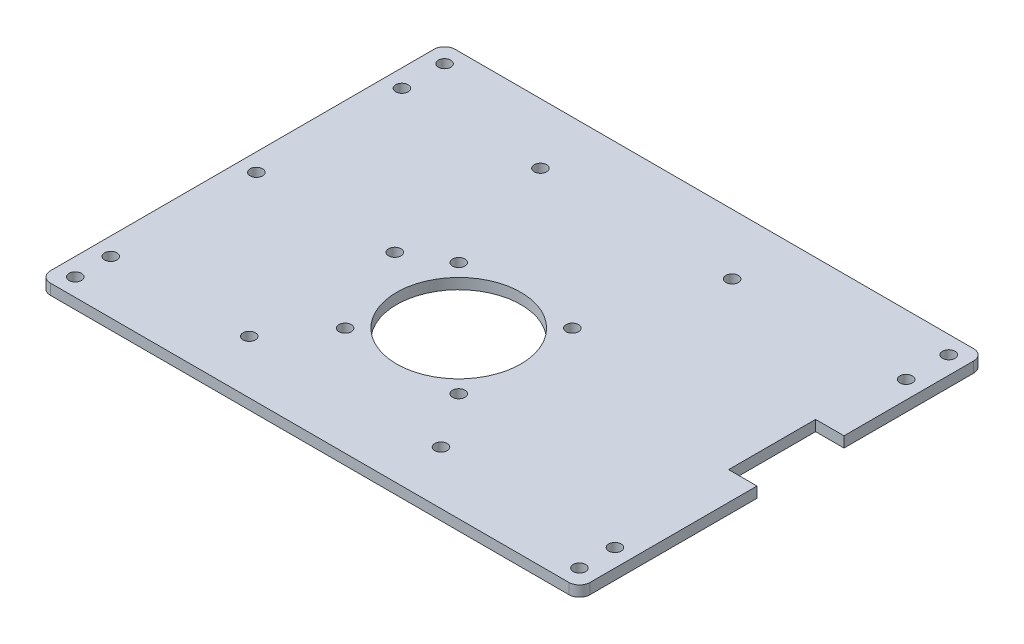
ISO-10303-21;
HEADER;
FILE_DESCRIPTION(('STEP AP214'),'2;1');
FILE_NAME('part.step','',(''),(''),'','','');
FILE_SCHEMA(('AUTOMOTIVE_DESIGN { 1 0 10303 214 1 1 1 1 }'));
ENDSEC;
DATA;
#1=APPLICATION_CONTEXT('core data for automotive mechanical design processes');
#2=APPLICATION_PROTOCOL_DEFINITION('international standard','automotive_design',2000,#1);
#3=PRODUCT_CONTEXT('',#1,'mechanical');
#4=PRODUCT('Part','Part','',(#3));
#5=PRODUCT_RELATED_PRODUCT_CATEGORY('part','',(#4));
#6=PRODUCT_DEFINITION_FORMATION('','',#4);
#7=PRODUCT_DEFINITION_CONTEXT('part definition',#1,'design');
#8=PRODUCT_DEFINITION('design','',#6,#7);
#9=PRODUCT_DEFINITION_SHAPE('','',#8);
#10=(LENGTH_UNIT() NAMED_UNIT(*) SI_UNIT(.MILLI.,.METRE.));
#11=(NAMED_UNIT(*) PLANE_ANGLE_UNIT() SI_UNIT($,.RADIAN.));
#12=(NAMED_UNIT(*) SI_UNIT($,.STERADIAN.) SOLID_ANGLE_UNIT());
#13=UNCERTAINTY_MEASURE_WITH_UNIT(LENGTH_MEASURE(1.E-05),#10,'distance_accuracy_value','');
#14=(GEOMETRIC_REPRESENTATION_CONTEXT(3) GLOBAL_UNCERTAINTY_ASSIGNED_CONTEXT((#13)) GLOBAL_UNIT_ASSIGNED_CONTEXT((#10,
#11,#12)) REPRESENTATION_CONTEXT('',''));
#15=CARTESIAN_POINT('',(0.,0.,0.));
#16=DIRECTION('',(0.,0.,1.));
#17=DIRECTION('',(1.,0.,0.));
#18=AXIS2_PLACEMENT_3D('',#15,#16,#17);
#19=CARTESIAN_POINT('',(-73.,3.,-54.));
#20=DIRECTION('',(0.,-1.,0.));
#21=DIRECTION('',(0.,0.,-1.));
#22=AXIS2_PLACEMENT_3D('',#19,#20,#21);
#23=PLANE('',#22);
#24=CARTESIAN_POINT('',(-73.,3.,-54.));
#25=DIRECTION('',(0.,1.,0.));
#26=DIRECTION('',(0.,0.,-1.));
#27=AXIS2_PLACEMENT_3D('',#24,#25,#26);
#28=CIRCLE('',#27,3.);
#29=CARTESIAN_POINT('',(-73.,3.,-57.));
#30=VERTEX_POINT('',#29);
#31=CARTESIAN_POINT('',(-76.,3.,-54.));
#32=VERTEX_POINT('',#31);
#33=EDGE_CURVE('E181',#30,#32,#28,.T.);
#34=ORIENTED_EDGE('',*,*,#33,.T.);
#35=DIRECTION('',(0.,0.,1.));
#36=VECTOR('',#35,1.);
#37=CARTESIAN_POINT('',(-76.,3.,-54.));
#38=LINE('',#37,#36);
#39=CARTESIAN_POINT('',(-76.,3.,54.));
#40=VERTEX_POINT('',#39);
#41=EDGE_CURVE('E109',#32,#40,#38,.T.);
#42=ORIENTED_EDGE('',*,*,#41,.T.);
#43=CARTESIAN_POINT('',(-73.,3.,54.));
#44=DIRECTION('',(0.,1.,0.));
#45=DIRECTION('',(0.,0.,-1.));
#46=AXIS2_PLACEMENT_3D('',#43,#44,#45);
#47=CIRCLE('',#46,3.);
#48=CARTESIAN_POINT('',(-73.,3.,57.));
#49=VERTEX_POINT('',#48);
#50=EDGE_CURVE('E208',#40,#49,#47,.T.);
#51=ORIENTED_EDGE('',*,*,#50,.T.);
#52=DIRECTION('',(1.,0.,0.));
#53=VECTOR('',#52,1.);
#54=CARTESIAN_POINT('',(-73.,3.,57.));
#55=LINE('',#54,#53);
#56=CARTESIAN_POINT('',(73.,3.,57.));
#57=VERTEX_POINT('',#56);
#58=EDGE_CURVE('E227',#49,#57,#55,.T.);
#59=ORIENTED_EDGE('',*,*,#58,.T.);
#60=CARTESIAN_POINT('',(73.,3.,54.));
#61=DIRECTION('',(0.,1.,0.));
#62=DIRECTION('',(0.,0.,-1.));
#63=AXIS2_PLACEMENT_3D('',#60,#61,#62);
#64=CIRCLE('',#63,3.);
#65=CARTESIAN_POINT('',(76.,3.,54.));
#66=VERTEX_POINT('',#65);
#67=EDGE_CURVE('E224',#57,#66,#64,.T.);
#68=ORIENTED_EDGE('',*,*,#67,.T.);
#69=DIRECTION('',(0.,0.,-1.));
#70=VECTOR('',#69,1.);
#71=CARTESIAN_POINT('',(76.,3.,7.));
#72=LINE('',#71,#70);
#73=CARTESIAN_POINT('',(76.,3.,7.));
#74=VERTEX_POINT('',#73);
#75=EDGE_CURVE('E226',#66,#74,#72,.T.);
#76=ORIENTED_EDGE('',*,*,#75,.T.);
#77=DIRECTION('',(-1.,0.,0.));
#78=VECTOR('',#77,1.);
#79=CARTESIAN_POINT('',(68.,3.,7.));
#80=LINE('',#79,#78);
#81=CARTESIAN_POINT('',(68.,3.,7.));
#82=VERTEX_POINT('',#81);
#83=EDGE_CURVE('E229',#74,#82,#80,.T.);
#84=ORIENTED_EDGE('',*,*,#83,.T.);
#85=DIRECTION('',(0.,0.,-1.));
#86=VECTOR('',#85,1.);
#87=CARTESIAN_POINT('',(68.,3.,-17.5));
#88=LINE('',#87,#86);
#89=CARTESIAN_POINT('',(68.,3.,-17.5));
#90=VERTEX_POINT('',#89);
#91=EDGE_CURVE('E235',#82,#90,#88,.T.);
#92=ORIENTED_EDGE('',*,*,#91,.T.);
#93=DIRECTION('',(1.,0.,0.));
#94=VECTOR('',#93,1.);
#95=CARTESIAN_POINT('',(76.,3.,-17.5));
#96=LINE('',#95,#94);
#97=CARTESIAN_POINT('',(76.,3.,-17.5));
#98=VERTEX_POINT('',#97);
#99=EDGE_CURVE('E140',#90,#98,#96,.T.);
#100=ORIENTED_EDGE('',*,*,#99,.T.);
#101=DIRECTION('',(0.,0.,-1.));
#102=VECTOR('',#101,1.);
#103=CARTESIAN_POINT('',(76.,3.,-54.));
#104=LINE('',#103,#102);
#105=CARTESIAN_POINT('',(76.,3.,-54.));
#106=VERTEX_POINT('',#105);
#107=EDGE_CURVE('E134',#98,#106,#104,.T.);
#108=ORIENTED_EDGE('',*,*,#107,.T.);
#109=CARTESIAN_POINT('',(73.,3.,-54.));
#110=DIRECTION('',(0.,1.,0.));
#111=DIRECTION('',(0.,0.,1.));
#112=AXIS2_PLACEMENT_3D('',#109,#110,#111);
#113=CIRCLE('',#112,3.);
#114=CARTESIAN_POINT('',(73.,3.,-57.));
#115=VERTEX_POINT('',#114);
#116=EDGE_CURVE('E138',#106,#115,#113,.T.);
#117=ORIENTED_EDGE('',*,*,#116,.T.);
#118=DIRECTION('',(-1.,0.,0.));
#119=VECTOR('',#118,1.);
#120=CARTESIAN_POINT('',(-73.,3.,-57.));
#121=LINE('',#120,#119);
#122=EDGE_CURVE('E54',#115,#30,#121,.T.);
#123=ORIENTED_EDGE('',*,*,#122,.T.);
#124=EDGE_LOOP('',(#34,#42,#51,#59,#68,#76,#84,#92,#100,#108,#117,#123));
#125=FACE_BOUND('',#124,.T.);
#126=CARTESIAN_POINT('',(-71.,3.,-51.9999999999995));
#127=DIRECTION('',(0.,1.,0.));
#128=DIRECTION('',(0.,0.,1.));
#129=AXIS2_PLACEMENT_3D('',#126,#127,#128);
#130=CIRCLE('',#129,1.75000000000013);
#131=CARTESIAN_POINT('',(-71.,3.,-50.2499999999994));
#132=VERTEX_POINT('',#131);
#133=EDGE_CURVE('E162',#132,#132,#130,.T.);
#134=ORIENTED_EDGE('',*,*,#133,.F.);
#135=EDGE_LOOP('',(#134));
#136=FACE_BOUND('',#135,.T.);
#137=CARTESIAN_POINT('',(71.,3.,-52.));
#138=DIRECTION('',(0.,1.,0.));
#139=DIRECTION('',(0.,0.,1.));
#140=AXIS2_PLACEMENT_3D('',#137,#138,#139);
#141=CIRCLE('',#140,1.75);
#142=CARTESIAN_POINT('',(71.,3.,-50.25));
#143=VERTEX_POINT('',#142);
#144=EDGE_CURVE('E449',#143,#143,#141,.T.);
#145=ORIENTED_EDGE('',*,*,#144,.F.);
#146=EDGE_LOOP('',(#145));
#147=FACE_BOUND('',#146,.T.);
#148=CARTESIAN_POINT('',(71.0000000000011,3.,52.));
#149=DIRECTION('',(0.,1.,0.));
#150=DIRECTION('',(0.,0.,1.));
#151=AXIS2_PLACEMENT_3D('',#148,#149,#150);
#152=CIRCLE('',#151,1.75);
#153=CARTESIAN_POINT('',(71.0000000000011,3.,53.75));
#154=VERTEX_POINT('',#153);
#155=EDGE_CURVE('E443',#154,#154,#152,.T.);
#156=ORIENTED_EDGE('',*,*,#155,.F.);
#157=EDGE_LOOP('',(#156));
#158=FACE_BOUND('',#157,.T.);
#159=CARTESIAN_POINT('',(-70.9999999999989,3.,52.));
#160=DIRECTION('',(0.,1.,0.));
#161=DIRECTION('',(0.,0.,1.));
#162=AXIS2_PLACEMENT_3D('',#159,#160,#161);
#163=CIRCLE('',#162,1.75);
#164=CARTESIAN_POINT('',(-70.9999999999989,3.,53.75));
#165=VERTEX_POINT('',#164);
#166=EDGE_CURVE('E437',#165,#165,#163,.T.);
#167=ORIENTED_EDGE('',*,*,#166,.F.);
#168=EDGE_LOOP('',(#167));
#169=FACE_BOUND('',#168,.T.);
#170=CARTESIAN_POINT('',(70.9999999999966,3.,-40.0000000000005));
#171=DIRECTION('',(0.,1.,0.));
#172=DIRECTION('',(0.,0.,1.));
#173=AXIS2_PLACEMENT_3D('',#170,#171,#172);
#174=CIRCLE('',#173,1.75000000000303);
#175=CARTESIAN_POINT('',(70.9999999999966,3.,-38.2499999999975));
#176=VERTEX_POINT('',#175);
#177=EDGE_CURVE('E431',#176,#176,#174,.T.);
#178=ORIENTED_EDGE('',*,*,#177,.F.);
#179=EDGE_LOOP('',(#178));
#180=FACE_BOUND('',#179,.T.);
#181=CARTESIAN_POINT('',(-4.50000000000001,3.,10.5));
#182=DIRECTION('',(0.,1.,0.));
#183=DIRECTION('',(0.,0.,1.));
#184=AXIS2_PLACEMENT_3D('',#181,#182,#183);
#185=CIRCLE('',#184,17.5);
#186=CARTESIAN_POINT('',(-4.50000000000001,3.,28.));
#187=VERTEX_POINT('',#186);
#188=EDGE_CURVE('E425',#187,#187,#185,.T.);
#189=ORIENTED_EDGE('',*,*,#188,.F.);
#190=EDGE_LOOP('',(#189));
#191=FACE_BOUND('',#190,.T.);
#192=CARTESIAN_POINT('',(-20.5,3.,-5.49999999999988));
#193=DIRECTION('',(0.,1.,0.));
#194=DIRECTION('',(0.,0.,1.));
#195=AXIS2_PLACEMENT_3D('',#192,#193,#194);
#196=CIRCLE('',#195,1.75000000000005);
#197=CARTESIAN_POINT('',(-20.5,3.,-3.74999999999983));
#198=VERTEX_POINT('',#197);
#199=EDGE_CURVE('E419',#198,#198,#196,.T.);
#200=ORIENTED_EDGE('',*,*,#199,.F.);
#201=EDGE_LOOP('',(#200));
#202=FACE_BOUND('',#201,.T.);
#203=CARTESIAN_POINT('',(11.5,3.,-5.5));
#204=DIRECTION('',(0.,1.,0.));
#205=DIRECTION('',(0.,0.,1.));
#206=AXIS2_PLACEMENT_3D('',#203,#204,#205);
#207=CIRCLE('',#206,1.75);
#208=CARTESIAN_POINT('',(11.5,3.,-3.75));
#209=VERTEX_POINT('',#208);
#210=EDGE_CURVE('E413',#209,#209,#207,.T.);
#211=ORIENTED_EDGE('',*,*,#210,.F.);
#212=EDGE_LOOP('',(#211));
#213=FACE_BOUND('',#212,.T.);
#214=CARTESIAN_POINT('',(11.5000000000003,3.,26.5));
#215=DIRECTION('',(0.,1.,0.));
#216=DIRECTION('',(0.,0.,1.));
#217=AXIS2_PLACEMENT_3D('',#214,#215,#216);
#218=CIRCLE('',#217,1.75);
#219=CARTESIAN_POINT('',(11.5000000000003,3.,28.25));
#220=VERTEX_POINT('',#219);
#221=EDGE_CURVE('E407',#220,#220,#218,.T.);
#222=ORIENTED_EDGE('',*,*,#221,.F.);
#223=EDGE_LOOP('',(#222));
#224=FACE_BOUND('',#223,.T.);
#225=CARTESIAN_POINT('',(-20.4999999999997,3.,26.5));
#226=DIRECTION('',(0.,1.,0.));
#227=DIRECTION('',(0.,0.,1.));
#228=AXIS2_PLACEMENT_3D('',#225,#226,#227);
#229=CIRCLE('',#228,1.75);
#230=CARTESIAN_POINT('',(-20.4999999999997,3.,28.25));
#231=VERTEX_POINT('',#230);
#232=EDGE_CURVE('E401',#231,#231,#229,.T.);
#233=ORIENTED_EDGE('',*,*,#232,.F.);
#234=EDGE_LOOP('',(#233));
#235=FACE_BOUND('',#234,.T.);
#236=CARTESIAN_POINT('',(22.,3.,-39.9999999999997));
#237=DIRECTION('',(0.,1.,0.));
#238=DIRECTION('',(0.,0.,1.));
#239=AXIS2_PLACEMENT_3D('',#236,#237,#238);
#240=CIRCLE('',#239,1.75);
#241=CARTESIAN_POINT('',(22.,3.,-38.2499999999997));
#242=VERTEX_POINT('',#241);
#243=EDGE_CURVE('E395',#242,#242,#240,.T.);
#244=ORIENTED_EDGE('',*,*,#243,.F.);
#245=EDGE_LOOP('',(#244));
#246=FACE_BOUND('',#245,.T.);
#247=CARTESIAN_POINT('',(22.0000000000008,3.,42.0000000000003));
#248=DIRECTION('',(0.,1.,0.));
#249=DIRECTION('',(0.,0.,1.));
#250=AXIS2_PLACEMENT_3D('',#247,#248,#249);
#251=CIRCLE('',#250,1.75);
#252=CARTESIAN_POINT('',(22.0000000000008,3.,43.7500000000003));
#253=VERTEX_POINT('',#252);
#254=EDGE_CURVE('E389',#253,#253,#251,.T.);
#255=ORIENTED_EDGE('',*,*,#254,.F.);
#256=EDGE_LOOP('',(#255));
#257=FACE_BOUND('',#256,.T.);
#258=CARTESIAN_POINT('',(70.9999999999989,3.,42.));
#259=DIRECTION('',(0.,1.,0.));
#260=DIRECTION('',(0.,0.,1.));
#261=AXIS2_PLACEMENT_3D('',#258,#259,#260);
#262=CIRCLE('',#261,1.75000000000185);
#263=CARTESIAN_POINT('',(70.9999999999989,3.,43.7500000000018));
#264=VERTEX_POINT('',#263);
#265=EDGE_CURVE('E383',#264,#264,#262,.T.);
#266=ORIENTED_EDGE('',*,*,#265,.F.);
#267=EDGE_LOOP('',(#266));
#268=FACE_BOUND('',#267,.T.);
#269=CARTESIAN_POINT('',(-70.9999999999975,3.,-40.0000000000005));
#270=DIRECTION('',(0.,1.,0.));
#271=DIRECTION('',(0.,0.,-1.));
#272=AXIS2_PLACEMENT_3D('',#269,#270,#271);
#273=CIRCLE('',#272,1.75000000000224);
#274=CARTESIAN_POINT('',(-70.9999999999975,3.,-41.7500000000027));
#275=VERTEX_POINT('',#274);
#276=EDGE_CURVE('E377',#275,#275,#273,.T.);
#277=ORIENTED_EDGE('',*,*,#276,.F.);
#278=EDGE_LOOP('',(#277));
#279=FACE_BOUND('',#278,.T.);
#280=CARTESIAN_POINT('',(-31.9999999999975,3.,-40.0000000000005));
#281=DIRECTION('',(0.,1.,0.));
#282=DIRECTION('',(0.,0.,-1.));
#283=AXIS2_PLACEMENT_3D('',#280,#281,#282);
#284=CIRCLE('',#283,1.75000000000224);
#285=CARTESIAN_POINT('',(-31.9999999999975,3.,-41.7500000000027));
#286=VERTEX_POINT('',#285);
#287=EDGE_CURVE('E371',#286,#286,#284,.T.);
#288=ORIENTED_EDGE('',*,*,#287,.F.);
#289=EDGE_LOOP('',(#288));
#290=FACE_BOUND('',#289,.T.);
#291=CARTESIAN_POINT('',(-31.9999999999971,3.,0.999999999999494));
#292=DIRECTION('',(0.,1.,0.));
#293=DIRECTION('',(0.,0.,-1.));
#294=AXIS2_PLACEMENT_3D('',#291,#292,#293);
#295=CIRCLE('',#294,1.75000000000224);
#296=CARTESIAN_POINT('',(-31.9999999999971,3.,-0.750000000002742));
#297=VERTEX_POINT('',#296);
#298=EDGE_CURVE('E365',#297,#297,#295,.T.);
#299=ORIENTED_EDGE('',*,*,#298,.F.);
#300=EDGE_LOOP('',(#299));
#301=FACE_BOUND('',#300,.T.);
#302=CARTESIAN_POINT('',(-31.9999999999966,3.,41.9999999999995));
#303=DIRECTION('',(0.,1.,0.));
#304=DIRECTION('',(0.,0.,-1.));
#305=AXIS2_PLACEMENT_3D('',#302,#303,#304);
#306=CIRCLE('',#305,1.75000000000224);
#307=CARTESIAN_POINT('',(-31.9999999999966,3.,40.2499999999973));
#308=VERTEX_POINT('',#307);
#309=EDGE_CURVE('E359',#308,#308,#306,.T.);
#310=ORIENTED_EDGE('',*,*,#309,.F.);
#311=EDGE_LOOP('',(#310));
#312=FACE_BOUND('',#311,.T.);
#313=CARTESIAN_POINT('',(-70.9999999999971,3.,0.999999999999494));
#314=DIRECTION('',(0.,1.,0.));
#315=DIRECTION('',(0.,0.,-1.));
#316=AXIS2_PLACEMENT_3D('',#313,#314,#315);
#317=CIRCLE('',#316,1.75000000000224);
#318=CARTESIAN_POINT('',(-70.9999999999971,3.,-0.750000000002742));
#319=VERTEX_POINT('',#318);
#320=EDGE_CURVE('E353',#319,#319,#317,.T.);
#321=ORIENTED_EDGE('',*,*,#320,.F.);
#322=EDGE_LOOP('',(#321));
#323=FACE_BOUND('',#322,.T.);
#324=CARTESIAN_POINT('',(-70.9999999999966,3.,41.9999999999995));
#325=DIRECTION('',(0.,1.,0.));
#326=DIRECTION('',(0.,0.,-1.));
#327=AXIS2_PLACEMENT_3D('',#324,#325,#326);
#328=CIRCLE('',#327,1.75000000000224);
#329=CARTESIAN_POINT('',(-70.9999999999966,3.,40.2499999999973));
#330=VERTEX_POINT('',#329);
#331=EDGE_CURVE('E344',#330,#330,#328,.T.);
#332=ORIENTED_EDGE('',*,*,#331,.F.);
#333=EDGE_LOOP('',(#332));
#334=FACE_BOUND('',#333,.T.);
#335=ADVANCED_FACE('F37',(#125,#136,#147,#158,#169,#180,#191,#202,#213,#224,#235,#246,#257,#268,
#279,#290,#301,#312,#323,#334),#23,.F.);
#336=CARTESIAN_POINT('',(-73.,0.,-54.));
#337=DIRECTION('',(0.,-1.,0.));
#338=DIRECTION('',(0.,0.,-1.));
#339=AXIS2_PLACEMENT_3D('',#336,#337,#338);
#340=PLANE('',#339);
#341=CARTESIAN_POINT('',(-70.9999999999971,0.,0.999999999999494));
#342=DIRECTION('',(0.,1.,0.));
#343=DIRECTION('',(0.,0.,-1.));
#344=AXIS2_PLACEMENT_3D('',#341,#342,#343);
#345=CIRCLE('',#344,1.75000000000224);
#346=CARTESIAN_POINT('',(-70.9999999999971,0.,-0.750000000002742));
#347=VERTEX_POINT('',#346);
#348=EDGE_CURVE('E350',#347,#347,#345,.T.);
#349=ORIENTED_EDGE('',*,*,#348,.T.);
#350=EDGE_LOOP('',(#349));
#351=FACE_BOUND('',#350,.T.);
#352=CARTESIAN_POINT('',(-31.9999999999971,0.,0.999999999999494));
#353=DIRECTION('',(0.,1.,0.));
#354=DIRECTION('',(0.,0.,-1.));
#355=AXIS2_PLACEMENT_3D('',#352,#353,#354);
#356=CIRCLE('',#355,1.75000000000224);
#357=CARTESIAN_POINT('',(-31.9999999999971,0.,-0.750000000002742));
#358=VERTEX_POINT('',#357);
#359=EDGE_CURVE('E362',#358,#358,#356,.T.);
#360=ORIENTED_EDGE('',*,*,#359,.T.);
#361=EDGE_LOOP('',(#360));
#362=FACE_BOUND('',#361,.T.);
#363=CARTESIAN_POINT('',(-70.9999999999975,0.,-40.0000000000005));
#364=DIRECTION('',(0.,1.,0.));
#365=DIRECTION('',(0.,0.,-1.));
#366=AXIS2_PLACEMENT_3D('',#363,#364,#365);
#367=CIRCLE('',#366,1.75000000000224);
#368=CARTESIAN_POINT('',(-70.9999999999975,0.,-41.7500000000027));
#369=VERTEX_POINT('',#368);
#370=EDGE_CURVE('E374',#369,#369,#367,.T.);
#371=ORIENTED_EDGE('',*,*,#370,.T.);
#372=EDGE_LOOP('',(#371));
#373=FACE_BOUND('',#372,.T.);
#374=CARTESIAN_POINT('',(22.0000000000008,0.,42.0000000000003));
#375=DIRECTION('',(0.,1.,0.));
#376=DIRECTION('',(0.,0.,1.));
#377=AXIS2_PLACEMENT_3D('',#374,#375,#376);
#378=CIRCLE('',#377,1.75);
#379=CARTESIAN_POINT('',(22.0000000000008,0.,43.7500000000003));
#380=VERTEX_POINT('',#379);
#381=EDGE_CURVE('E386',#380,#380,#378,.T.);
#382=ORIENTED_EDGE('',*,*,#381,.T.);
#383=EDGE_LOOP('',(#382));
#384=FACE_BOUND('',#383,.T.);
#385=CARTESIAN_POINT('',(-20.4999999999997,0.,26.5));
#386=DIRECTION('',(0.,1.,0.));
#387=DIRECTION('',(0.,0.,1.));
#388=AXIS2_PLACEMENT_3D('',#385,#386,#387);
#389=CIRCLE('',#388,1.75);
#390=CARTESIAN_POINT('',(-20.4999999999997,0.,28.25));
#391=VERTEX_POINT('',#390);
#392=EDGE_CURVE('E398',#391,#391,#389,.T.);
#393=ORIENTED_EDGE('',*,*,#392,.T.);
#394=EDGE_LOOP('',(#393));
#395=FACE_BOUND('',#394,.T.);
#396=CARTESIAN_POINT('',(11.5,0.,-5.5));
#397=DIRECTION('',(0.,1.,0.));
#398=DIRECTION('',(0.,0.,1.));
#399=AXIS2_PLACEMENT_3D('',#396,#397,#398);
#400=CIRCLE('',#399,1.75);
#401=CARTESIAN_POINT('',(11.5,0.,-3.75));
#402=VERTEX_POINT('',#401);
#403=EDGE_CURVE('E410',#402,#402,#400,.T.);
#404=ORIENTED_EDGE('',*,*,#403,.T.);
#405=EDGE_LOOP('',(#404));
#406=FACE_BOUND('',#405,.T.);
#407=CARTESIAN_POINT('',(-4.50000000000001,0.,10.5));
#408=DIRECTION('',(0.,1.,0.));
#409=DIRECTION('',(0.,0.,1.));
#410=AXIS2_PLACEMENT_3D('',#407,#408,#409);
#411=CIRCLE('',#410,17.5);
#412=CARTESIAN_POINT('',(-4.50000000000001,0.,28.));
#413=VERTEX_POINT('',#412);
#414=EDGE_CURVE('E422',#413,#413,#411,.T.);
#415=ORIENTED_EDGE('',*,*,#414,.T.);
#416=EDGE_LOOP('',(#415));
#417=FACE_BOUND('',#416,.T.);
#418=CARTESIAN_POINT('',(-70.9999999999989,0.,52.));
#419=DIRECTION('',(0.,1.,0.));
#420=DIRECTION('',(0.,0.,1.));
#421=AXIS2_PLACEMENT_3D('',#418,#419,#420);
#422=CIRCLE('',#421,1.75);
#423=CARTESIAN_POINT('',(-70.9999999999989,0.,53.75));
#424=VERTEX_POINT('',#423);
#425=EDGE_CURVE('E434',#424,#424,#422,.T.);
#426=ORIENTED_EDGE('',*,*,#425,.T.);
#427=EDGE_LOOP('',(#426));
#428=FACE_BOUND('',#427,.T.);
#429=CARTESIAN_POINT('',(71.,0.,-52.));
#430=DIRECTION('',(0.,1.,0.));
#431=DIRECTION('',(0.,0.,1.));
#432=AXIS2_PLACEMENT_3D('',#429,#430,#431);
#433=CIRCLE('',#432,1.75);
#434=CARTESIAN_POINT('',(71.,0.,-50.25));
#435=VERTEX_POINT('',#434);
#436=EDGE_CURVE('E446',#435,#435,#433,.T.);
#437=ORIENTED_EDGE('',*,*,#436,.T.);
#438=EDGE_LOOP('',(#437));
#439=FACE_BOUND('',#438,.T.);
#440=CARTESIAN_POINT('',(-73.,0.,-54.));
#441=DIRECTION('',(0.,1.,0.));
#442=DIRECTION('',(0.,0.,-1.));
#443=AXIS2_PLACEMENT_3D('',#440,#441,#442);
#444=CIRCLE('',#443,3.);
#445=CARTESIAN_POINT('',(-73.,0.,-57.));
#446=VERTEX_POINT('',#445);
#447=CARTESIAN_POINT('',(-76.,0.,-54.));
#448=VERTEX_POINT('',#447);
#449=EDGE_CURVE('E158',#446,#448,#444,.T.);
#450=ORIENTED_EDGE('',*,*,#449,.F.);
#451=DIRECTION('',(-1.,0.,0.));
#452=VECTOR('',#451,1.);
#453=CARTESIAN_POINT('',(-73.,0.,-57.));
#454=LINE('',#453,#452);
#455=CARTESIAN_POINT('',(73.,0.,-57.));
#456=VERTEX_POINT('',#455);
#457=EDGE_CURVE('E101',#456,#446,#454,.T.);
#458=ORIENTED_EDGE('',*,*,#457,.F.);
#459=CARTESIAN_POINT('',(73.,0.,-54.));
#460=DIRECTION('',(0.,1.,0.));
#461=DIRECTION('',(0.,0.,1.));
#462=AXIS2_PLACEMENT_3D('',#459,#460,#461);
#463=CIRCLE('',#462,3.);
#464=CARTESIAN_POINT('',(76.,0.,-54.));
#465=VERTEX_POINT('',#464);
#466=EDGE_CURVE('E95',#465,#456,#463,.T.);
#467=ORIENTED_EDGE('',*,*,#466,.F.);
#468=DIRECTION('',(0.,0.,-1.));
#469=VECTOR('',#468,1.);
#470=CARTESIAN_POINT('',(76.,0.,-54.));
#471=LINE('',#470,#469);
#472=CARTESIAN_POINT('',(76.,0.,-17.5));
#473=VERTEX_POINT('',#472);
#474=EDGE_CURVE('E148',#473,#465,#471,.T.);
#475=ORIENTED_EDGE('',*,*,#474,.F.);
#476=DIRECTION('',(1.,0.,0.));
#477=VECTOR('',#476,1.);
#478=CARTESIAN_POINT('',(76.,0.,-17.5));
#479=LINE('',#478,#477);
#480=CARTESIAN_POINT('',(68.,0.,-17.5));
#481=VERTEX_POINT('',#480);
#482=EDGE_CURVE('E176',#481,#473,#479,.T.);
#483=ORIENTED_EDGE('',*,*,#482,.F.);
#484=DIRECTION('',(0.,0.,-1.));
#485=VECTOR('',#484,1.);
#486=CARTESIAN_POINT('',(68.,0.,-17.5));
#487=LINE('',#486,#485);
#488=CARTESIAN_POINT('',(68.,0.,7.));
#489=VERTEX_POINT('',#488);
#490=EDGE_CURVE('E174',#489,#481,#487,.T.);
#491=ORIENTED_EDGE('',*,*,#490,.F.);
#492=DIRECTION('',(-1.,0.,0.));
#493=VECTOR('',#492,1.);
#494=CARTESIAN_POINT('',(68.,0.,7.));
#495=LINE('',#494,#493);
#496=CARTESIAN_POINT('',(76.,0.,7.));
#497=VERTEX_POINT('',#496);
#498=EDGE_CURVE('E172',#497,#489,#495,.T.);
#499=ORIENTED_EDGE('',*,*,#498,.F.);
#500=DIRECTION('',(0.,0.,-1.));
#501=VECTOR('',#500,1.);
#502=CARTESIAN_POINT('',(76.,0.,7.));
#503=LINE('',#502,#501);
#504=CARTESIAN_POINT('',(76.,0.,54.));
#505=VERTEX_POINT('',#504);
#506=EDGE_CURVE('E170',#505,#497,#503,.T.);
#507=ORIENTED_EDGE('',*,*,#506,.F.);
#508=CARTESIAN_POINT('',(73.,0.,54.));
#509=DIRECTION('',(0.,1.,0.));
#510=DIRECTION('',(0.,0.,-1.));
#511=AXIS2_PLACEMENT_3D('',#508,#509,#510);
#512=CIRCLE('',#511,3.);
#513=CARTESIAN_POINT('',(73.,0.,57.));
#514=VERTEX_POINT('',#513);
#515=EDGE_CURVE('E168',#514,#505,#512,.T.);
#516=ORIENTED_EDGE('',*,*,#515,.F.);
#517=DIRECTION('',(1.,0.,0.));
#518=VECTOR('',#517,1.);
#519=CARTESIAN_POINT('',(-73.,0.,57.));
#520=LINE('',#519,#518);
#521=CARTESIAN_POINT('',(-73.,0.,57.));
#522=VERTEX_POINT('',#521);
#523=EDGE_CURVE('E166',#522,#514,#520,.T.);
#524=ORIENTED_EDGE('',*,*,#523,.F.);
#525=CARTESIAN_POINT('',(-73.,0.,54.));
#526=DIRECTION('',(0.,1.,0.));
#527=DIRECTION('',(0.,0.,-1.));
#528=AXIS2_PLACEMENT_3D('',#525,#526,#527);
#529=CIRCLE('',#528,3.);
#530=CARTESIAN_POINT('',(-76.,0.,54.));
#531=VERTEX_POINT('',#530);
#532=EDGE_CURVE('E164',#531,#522,#529,.T.);
#533=ORIENTED_EDGE('',*,*,#532,.F.);
#534=DIRECTION('',(0.,0.,1.));
#535=VECTOR('',#534,1.);
#536=CARTESIAN_POINT('',(-76.,0.,-54.));
#537=LINE('',#536,#535);
#538=EDGE_CURVE('E161',#448,#531,#537,.T.);
#539=ORIENTED_EDGE('',*,*,#538,.F.);
#540=EDGE_LOOP('',(#450,#458,#467,#475,#483,#491,#499,#507,#516,#524,#533,#539));
#541=FACE_BOUND('',#540,.T.);
#542=CARTESIAN_POINT('',(-71.,0.,-51.9999999999995));
#543=DIRECTION('',(0.,1.,0.));
#544=DIRECTION('',(0.,0.,1.));
#545=AXIS2_PLACEMENT_3D('',#542,#543,#544);
#546=CIRCLE('',#545,1.75000000000013);
#547=CARTESIAN_POINT('',(-71.,0.,-50.2499999999994));
#548=VERTEX_POINT('',#547);
#549=EDGE_CURVE('E452',#548,#548,#546,.T.);
#550=ORIENTED_EDGE('',*,*,#549,.T.);
#551=EDGE_LOOP('',(#550));
#552=FACE_BOUND('',#551,.T.);
#553=CARTESIAN_POINT('',(71.0000000000011,0.,52.));
#554=DIRECTION('',(0.,1.,0.));
#555=DIRECTION('',(0.,0.,1.));
#556=AXIS2_PLACEMENT_3D('',#553,#554,#555);
#557=CIRCLE('',#556,1.75);
#558=CARTESIAN_POINT('',(71.0000000000011,0.,53.75));
#559=VERTEX_POINT('',#558);
#560=EDGE_CURVE('E440',#559,#559,#557,.T.);
#561=ORIENTED_EDGE('',*,*,#560,.T.);
#562=EDGE_LOOP('',(#561));
#563=FACE_BOUND('',#562,.T.);
#564=CARTESIAN_POINT('',(70.9999999999966,0.,-40.0000000000005));
#565=DIRECTION('',(0.,1.,0.));
#566=DIRECTION('',(0.,0.,1.));
#567=AXIS2_PLACEMENT_3D('',#564,#565,#566);
#568=CIRCLE('',#567,1.75000000000303);
#569=CARTESIAN_POINT('',(70.9999999999966,0.,-38.2499999999975));
#570=VERTEX_POINT('',#569);
#571=EDGE_CURVE('E428',#570,#570,#568,.T.);
#572=ORIENTED_EDGE('',*,*,#571,.T.);
#573=EDGE_LOOP('',(#572));
#574=FACE_BOUND('',#573,.T.);
#575=CARTESIAN_POINT('',(-20.5,0.,-5.49999999999988));
#576=DIRECTION('',(0.,1.,0.));
#577=DIRECTION('',(0.,0.,1.));
#578=AXIS2_PLACEMENT_3D('',#575,#576,#577);
#579=CIRCLE('',#578,1.75000000000005);
#580=CARTESIAN_POINT('',(-20.5,0.,-3.74999999999983));
#581=VERTEX_POINT('',#580);
#582=EDGE_CURVE('E416',#581,#581,#579,.T.);
#583=ORIENTED_EDGE('',*,*,#582,.T.);
#584=EDGE_LOOP('',(#583));
#585=FACE_BOUND('',#584,.T.);
#586=CARTESIAN_POINT('',(11.5000000000003,0.,26.5));
#587=DIRECTION('',(0.,1.,0.));
#588=DIRECTION('',(0.,0.,1.));
#589=AXIS2_PLACEMENT_3D('',#586,#587,#588);
#590=CIRCLE('',#589,1.75);
#591=CARTESIAN_POINT('',(11.5000000000003,0.,28.25));
#592=VERTEX_POINT('',#591);
#593=EDGE_CURVE('E404',#592,#592,#590,.T.);
#594=ORIENTED_EDGE('',*,*,#593,.T.);
#595=EDGE_LOOP('',(#594));
#596=FACE_BOUND('',#595,.T.);
#597=CARTESIAN_POINT('',(22.,0.,-39.9999999999997));
#598=DIRECTION('',(0.,1.,0.));
#599=DIRECTION('',(0.,0.,1.));
#600=AXIS2_PLACEMENT_3D('',#597,#598,#599);
#601=CIRCLE('',#600,1.75);
#602=CARTESIAN_POINT('',(22.,0.,-38.2499999999997));
#603=VERTEX_POINT('',#602);
#604=EDGE_CURVE('E392',#603,#603,#601,.T.);
#605=ORIENTED_EDGE('',*,*,#604,.T.);
#606=EDGE_LOOP('',(#605));
#607=FACE_BOUND('',#606,.T.);
#608=CARTESIAN_POINT('',(70.9999999999989,0.,42.));
#609=DIRECTION('',(0.,1.,0.));
#610=DIRECTION('',(0.,0.,1.));
#611=AXIS2_PLACEMENT_3D('',#608,#609,#610);
#612=CIRCLE('',#611,1.75000000000185);
#613=CARTESIAN_POINT('',(70.9999999999989,0.,43.7500000000018));
#614=VERTEX_POINT('',#613);
#615=EDGE_CURVE('E380',#614,#614,#612,.T.);
#616=ORIENTED_EDGE('',*,*,#615,.T.);
#617=EDGE_LOOP('',(#616));
#618=FACE_BOUND('',#617,.T.);
#619=CARTESIAN_POINT('',(-31.9999999999975,0.,-40.0000000000005));
#620=DIRECTION('',(0.,1.,0.));
#621=DIRECTION('',(0.,0.,-1.));
#622=AXIS2_PLACEMENT_3D('',#619,#620,#621);
#623=CIRCLE('',#622,1.75000000000224);
#624=CARTESIAN_POINT('',(-31.9999999999975,0.,-41.7500000000027));
#625=VERTEX_POINT('',#624);
#626=EDGE_CURVE('E368',#625,#625,#623,.T.);
#627=ORIENTED_EDGE('',*,*,#626,.T.);
#628=EDGE_LOOP('',(#627));
#629=FACE_BOUND('',#628,.T.);
#630=CARTESIAN_POINT('',(-31.9999999999966,0.,41.9999999999995));
#631=DIRECTION('',(0.,1.,0.));
#632=DIRECTION('',(0.,0.,-1.));
#633=AXIS2_PLACEMENT_3D('',#630,#631,#632);
#634=CIRCLE('',#633,1.75000000000224);
#635=CARTESIAN_POINT('',(-31.9999999999966,0.,40.2499999999973));
#636=VERTEX_POINT('',#635);
#637=EDGE_CURVE('E356',#636,#636,#634,.T.);
#638=ORIENTED_EDGE('',*,*,#637,.T.);
#639=EDGE_LOOP('',(#638));
#640=FACE_BOUND('',#639,.T.);
#641=CARTESIAN_POINT('',(-70.9999999999966,0.,41.9999999999995));
#642=DIRECTION('',(0.,1.,0.));
#643=DIRECTION('',(0.,0.,-1.));
#644=AXIS2_PLACEMENT_3D('',#641,#642,#643);
#645=CIRCLE('',#644,1.75000000000224);
#646=CARTESIAN_POINT('',(-70.9999999999966,0.,40.2499999999973));
#647=VERTEX_POINT('',#646);
#648=EDGE_CURVE('E347',#647,#647,#645,.T.);
#649=ORIENTED_EDGE('',*,*,#648,.T.);
#650=EDGE_LOOP('',(#649));
#651=FACE_BOUND('',#650,.T.);
#652=ADVANCED_FACE('F212',(#351,#362,#373,#384,#395,#406,#417,#428,#439,#541,#552,#563,#574,
#585,#596,#607,#618,#629,#640,#651),#340,.T.);
#653=CARTESIAN_POINT('',(-73.,3.,-54.));
#654=DIRECTION('',(0.,-1.,0.));
#655=DIRECTION('',(0.,0.,-1.));
#656=AXIS2_PLACEMENT_3D('',#653,#654,#655);
#657=CYLINDRICAL_SURFACE('',#656,3.);
#658=ORIENTED_EDGE('',*,*,#449,.T.);
#659=DIRECTION('',(0.,-1.,0.));
#660=VECTOR('',#659,1.);
#661=CARTESIAN_POINT('',(-76.,3.,-54.));
#662=LINE('',#661,#660);
#663=EDGE_CURVE('E11',#32,#448,#662,.T.);
#664=ORIENTED_EDGE('',*,*,#663,.F.);
#665=ORIENTED_EDGE('',*,*,#33,.F.);
#666=DIRECTION('',(0.,-1.,0.));
#667=VECTOR('',#666,1.);
#668=CARTESIAN_POINT('',(-73.,3.,-57.));
#669=LINE('',#668,#667);
#670=EDGE_CURVE('E154',#30,#446,#669,.T.);
#671=ORIENTED_EDGE('',*,*,#670,.T.);
#672=EDGE_LOOP('',(#658,#664,#665,#671));
#673=FACE_BOUND('',#672,.T.);
#674=ADVANCED_FACE('F39',(#673),#657,.T.);
#675=CARTESIAN_POINT('',(-76.,3.,-54.));
#676=DIRECTION('',(1.,0.,0.));
#677=DIRECTION('',(0.,0.,-1.));
#678=AXIS2_PLACEMENT_3D('',#675,#676,#677);
#679=PLANE('',#678);
#680=ORIENTED_EDGE('',*,*,#538,.T.);
#681=DIRECTION('',(0.,-1.,0.));
#682=VECTOR('',#681,1.);
#683=CARTESIAN_POINT('',(-76.,3.,54.));
#684=LINE('',#683,#682);
#685=EDGE_CURVE('E46',#40,#531,#684,.T.);
#686=ORIENTED_EDGE('',*,*,#685,.F.);
#687=ORIENTED_EDGE('',*,*,#41,.F.);
#688=ORIENTED_EDGE('',*,*,#663,.T.);
#689=EDGE_LOOP('',(#680,#686,#687,#688));
#690=FACE_BOUND('',#689,.T.);
#691=ADVANCED_FACE('F709',(#690),#679,.F.);
#692=CARTESIAN_POINT('',(-73.,3.,54.));
#693=DIRECTION('',(0.,-1.,0.));
#694=DIRECTION('',(0.,0.,-1.));
#695=AXIS2_PLACEMENT_3D('',#692,#693,#694);
#696=CYLINDRICAL_SURFACE('',#695,3.);
#697=ORIENTED_EDGE('',*,*,#532,.T.);
#698=DIRECTION('',(0.,-1.,0.));
#699=VECTOR('',#698,1.);
#700=CARTESIAN_POINT('',(-73.,3.,57.));
#701=LINE('',#700,#699);
#702=EDGE_CURVE('E200',#49,#522,#701,.T.);
#703=ORIENTED_EDGE('',*,*,#702,.F.);
#704=ORIENTED_EDGE('',*,*,#50,.F.);
#705=ORIENTED_EDGE('',*,*,#685,.T.);
#706=EDGE_LOOP('',(#697,#703,#704,#705));
#707=FACE_BOUND('',#706,.T.);
#708=ADVANCED_FACE('F206',(#707),#696,.T.);
#709=CARTESIAN_POINT('',(-73.,3.,57.));
#710=DIRECTION('',(0.,0.,-1.));
#711=DIRECTION('',(-1.,0.,0.));
#712=AXIS2_PLACEMENT_3D('',#709,#710,#711);
#713=PLANE('',#712);
#714=ORIENTED_EDGE('',*,*,#523,.T.);
#715=DIRECTION('',(0.,-1.,0.));
#716=VECTOR('',#715,1.);
#717=CARTESIAN_POINT('',(73.,3.,57.));
#718=LINE('',#717,#716);
#719=EDGE_CURVE('E197',#57,#514,#718,.T.);
#720=ORIENTED_EDGE('',*,*,#719,.F.);
#721=ORIENTED_EDGE('',*,*,#58,.F.);
#722=ORIENTED_EDGE('',*,*,#702,.T.);
#723=EDGE_LOOP('',(#714,#720,#721,#722));
#724=FACE_BOUND('',#723,.T.);
#725=ADVANCED_FACE('F218',(#724),#713,.F.);
#726=CARTESIAN_POINT('',(73.,3.,54.));
#727=DIRECTION('',(0.,-1.,0.));
#728=DIRECTION('',(0.,0.,-1.));
#729=AXIS2_PLACEMENT_3D('',#726,#727,#728);
#730=CYLINDRICAL_SURFACE('',#729,3.);
#731=ORIENTED_EDGE('',*,*,#515,.T.);
#732=DIRECTION('',(0.,-1.,0.));
#733=VECTOR('',#732,1.);
#734=CARTESIAN_POINT('',(76.,3.,54.));
#735=LINE('',#734,#733);
#736=EDGE_CURVE('E194',#66,#505,#735,.T.);
#737=ORIENTED_EDGE('',*,*,#736,.F.);
#738=ORIENTED_EDGE('',*,*,#67,.F.);
#739=ORIENTED_EDGE('',*,*,#719,.T.);
#740=EDGE_LOOP('',(#731,#737,#738,#739));
#741=FACE_BOUND('',#740,.T.);
#742=ADVANCED_FACE('F222',(#741),#730,.T.);
#743=CARTESIAN_POINT('',(76.,3.,7.));
#744=DIRECTION('',(-1.,0.,0.));
#745=DIRECTION('',(0.,0.,1.));
#746=AXIS2_PLACEMENT_3D('',#743,#744,#745);
#747=PLANE('',#746);
#748=ORIENTED_EDGE('',*,*,#506,.T.);
#749=DIRECTION('',(0.,-1.,0.));
#750=VECTOR('',#749,1.);
#751=CARTESIAN_POINT('',(76.,3.,7.));
#752=LINE('',#751,#750);
#753=EDGE_CURVE('E191',#74,#497,#752,.T.);
#754=ORIENTED_EDGE('',*,*,#753,.F.);
#755=ORIENTED_EDGE('',*,*,#75,.F.);
#756=ORIENTED_EDGE('',*,*,#736,.T.);
#757=EDGE_LOOP('',(#748,#754,#755,#756));
#758=FACE_BOUND('',#757,.T.);
#759=ADVANCED_FACE('F670',(#758),#747,.F.);
#760=CARTESIAN_POINT('',(68.,3.,7.));
#761=DIRECTION('',(0.,0.,1.));
#762=DIRECTION('',(1.,0.,0.));
#763=AXIS2_PLACEMENT_3D('',#760,#761,#762);
#764=PLANE('',#763);
#765=ORIENTED_EDGE('',*,*,#498,.T.);
#766=DIRECTION('',(0.,-1.,0.));
#767=VECTOR('',#766,1.);
#768=CARTESIAN_POINT('',(68.,3.,7.));
#769=LINE('',#768,#767);
#770=EDGE_CURVE('E188',#82,#489,#769,.T.);
#771=ORIENTED_EDGE('',*,*,#770,.F.);
#772=ORIENTED_EDGE('',*,*,#83,.F.);
#773=ORIENTED_EDGE('',*,*,#753,.T.);
#774=EDGE_LOOP('',(#765,#771,#772,#773));
#775=FACE_BOUND('',#774,.T.);
#776=ADVANCED_FACE('F660',(#775),#764,.F.);
#777=CARTESIAN_POINT('',(68.,3.,-17.5));
#778=DIRECTION('',(-1.,0.,0.));
#779=DIRECTION('',(0.,0.,1.));
#780=AXIS2_PLACEMENT_3D('',#777,#778,#779);
#781=PLANE('',#780);
#782=ORIENTED_EDGE('',*,*,#490,.T.);
#783=DIRECTION('',(0.,-1.,0.));
#784=VECTOR('',#783,1.);
#785=CARTESIAN_POINT('',(68.,3.,-17.5));
#786=LINE('',#785,#784);
#787=EDGE_CURVE('E185',#90,#481,#786,.T.);
#788=ORIENTED_EDGE('',*,*,#787,.F.);
#789=ORIENTED_EDGE('',*,*,#91,.F.);
#790=ORIENTED_EDGE('',*,*,#770,.T.);
#791=EDGE_LOOP('',(#782,#788,#789,#790));
#792=FACE_BOUND('',#791,.T.);
#793=ADVANCED_FACE('F241',(#792),#781,.F.);
#794=CARTESIAN_POINT('',(76.,3.,-17.5));
#795=DIRECTION('',(0.,0.,-1.));
#796=DIRECTION('',(-1.,0.,0.));
#797=AXIS2_PLACEMENT_3D('',#794,#795,#796);
#798=PLANE('',#797);
#799=ORIENTED_EDGE('',*,*,#482,.T.);
#800=DIRECTION('',(0.,-1.,0.));
#801=VECTOR('',#800,1.);
#802=CARTESIAN_POINT('',(76.,3.,-17.5));
#803=LINE('',#802,#801);
#804=EDGE_CURVE('E149',#98,#473,#803,.T.);
#805=ORIENTED_EDGE('',*,*,#804,.F.);
#806=ORIENTED_EDGE('',*,*,#99,.F.);
#807=ORIENTED_EDGE('',*,*,#787,.T.);
#808=EDGE_LOOP('',(#799,#805,#806,#807));
#809=FACE_BOUND('',#808,.T.);
#810=ADVANCED_FACE('F245',(#809),#798,.F.);
#811=CARTESIAN_POINT('',(76.,3.,-54.));
#812=DIRECTION('',(-1.,0.,0.));
#813=DIRECTION('',(0.,0.,1.));
#814=AXIS2_PLACEMENT_3D('',#811,#812,#813);
#815=PLANE('',#814);
#816=ORIENTED_EDGE('',*,*,#474,.T.);
#817=DIRECTION('',(0.,-1.,0.));
#818=VECTOR('',#817,1.);
#819=CARTESIAN_POINT('',(76.,3.,-54.));
#820=LINE('',#819,#818);
#821=EDGE_CURVE('E145',#106,#465,#820,.T.);
#822=ORIENTED_EDGE('',*,*,#821,.F.);
#823=ORIENTED_EDGE('',*,*,#107,.F.);
#824=ORIENTED_EDGE('',*,*,#804,.T.);
#825=EDGE_LOOP('',(#816,#822,#823,#824));
#826=FACE_BOUND('',#825,.T.);
#827=ADVANCED_FACE('F146',(#826),#815,.F.);
#828=CARTESIAN_POINT('',(73.,3.,-54.));
#829=DIRECTION('',(0.,-1.,0.));
#830=DIRECTION('',(0.,0.,-1.));
#831=AXIS2_PLACEMENT_3D('',#828,#829,#830);
#832=CYLINDRICAL_SURFACE('',#831,3.);
#833=ORIENTED_EDGE('',*,*,#466,.T.);
#834=DIRECTION('',(0.,-1.,0.));
#835=VECTOR('',#834,1.);
#836=CARTESIAN_POINT('',(73.,3.,-57.));
#837=LINE('',#836,#835);
#838=EDGE_CURVE('E150',#115,#456,#837,.T.);
#839=ORIENTED_EDGE('',*,*,#838,.F.);
#840=ORIENTED_EDGE('',*,*,#116,.F.);
#841=ORIENTED_EDGE('',*,*,#821,.T.);
#842=EDGE_LOOP('',(#833,#839,#840,#841));
#843=FACE_BOUND('',#842,.T.);
#844=ADVANCED_FACE('F152',(#843),#832,.T.);
#845=CARTESIAN_POINT('',(-73.,3.,-57.));
#846=DIRECTION('',(0.,0.,1.));
#847=DIRECTION('',(1.,0.,0.));
#848=AXIS2_PLACEMENT_3D('',#845,#846,#847);
#849=PLANE('',#848);
#850=ORIENTED_EDGE('',*,*,#457,.T.);
#851=ORIENTED_EDGE('',*,*,#670,.F.);
#852=ORIENTED_EDGE('',*,*,#122,.F.);
#853=ORIENTED_EDGE('',*,*,#838,.T.);
#854=EDGE_LOOP('',(#850,#851,#852,#853));
#855=FACE_BOUND('',#854,.T.);
#856=ADVANCED_FACE('F249',(#855),#849,.F.);
#857=CARTESIAN_POINT('',(-71.,3.,-51.9999999999995));
#858=DIRECTION('',(0.,-1.,0.));
#859=DIRECTION('',(0.,0.,-1.));
#860=AXIS2_PLACEMENT_3D('',#857,#858,#859);
#861=CYLINDRICAL_SURFACE('',#860,1.75000000000013);
#862=ORIENTED_EDGE('',*,*,#133,.T.);
#863=EDGE_LOOP('',(#862));
#864=FACE_BOUND('',#863,.T.);
#865=ORIENTED_EDGE('',*,*,#549,.F.);
#866=EDGE_LOOP('',(#865));
#867=FACE_BOUND('',#866,.T.);
#868=ADVANCED_FACE('F251',(#864,#867),#861,.F.);
#869=CARTESIAN_POINT('',(71.,3.,-52.));
#870=DIRECTION('',(0.,-1.,0.));
#871=DIRECTION('',(0.,0.,-1.));
#872=AXIS2_PLACEMENT_3D('',#869,#870,#871);
#873=CYLINDRICAL_SURFACE('',#872,1.75);
#874=ORIENTED_EDGE('',*,*,#144,.T.);
#875=EDGE_LOOP('',(#874));
#876=FACE_BOUND('',#875,.T.);
#877=ORIENTED_EDGE('',*,*,#436,.F.);
#878=EDGE_LOOP('',(#877));
#879=FACE_BOUND('',#878,.T.);
#880=ADVANCED_FACE('F257',(#876,#879),#873,.F.);
#881=CARTESIAN_POINT('',(71.0000000000011,3.,52.));
#882=DIRECTION('',(0.,-1.,0.));
#883=DIRECTION('',(0.,0.,-1.));
#884=AXIS2_PLACEMENT_3D('',#881,#882,#883);
#885=CYLINDRICAL_SURFACE('',#884,1.75);
#886=ORIENTED_EDGE('',*,*,#155,.T.);
#887=EDGE_LOOP('',(#886));
#888=FACE_BOUND('',#887,.T.);
#889=ORIENTED_EDGE('',*,*,#560,.F.);
#890=EDGE_LOOP('',(#889));
#891=FACE_BOUND('',#890,.T.);
#892=ADVANCED_FACE('F271',(#888,#891),#885,.F.);
#893=CARTESIAN_POINT('',(-70.9999999999989,3.,52.));
#894=DIRECTION('',(0.,-1.,0.));
#895=DIRECTION('',(0.,0.,-1.));
#896=AXIS2_PLACEMENT_3D('',#893,#894,#895);
#897=CYLINDRICAL_SURFACE('',#896,1.75);
#898=ORIENTED_EDGE('',*,*,#166,.T.);
#899=EDGE_LOOP('',(#898));
#900=FACE_BOUND('',#899,.T.);
#901=ORIENTED_EDGE('',*,*,#425,.F.);
#902=EDGE_LOOP('',(#901));
#903=FACE_BOUND('',#902,.T.);
#904=ADVANCED_FACE('F275',(#900,#903),#897,.F.);
#905=CARTESIAN_POINT('',(70.9999999999966,3.,-40.0000000000005));
#906=DIRECTION('',(0.,-1.,0.));
#907=DIRECTION('',(0.,0.,-1.));
#908=AXIS2_PLACEMENT_3D('',#905,#906,#907);
#909=CYLINDRICAL_SURFACE('',#908,1.75000000000303);
#910=ORIENTED_EDGE('',*,*,#177,.T.);
#911=EDGE_LOOP('',(#910));
#912=FACE_BOUND('',#911,.T.);
#913=ORIENTED_EDGE('',*,*,#571,.F.);
#914=EDGE_LOOP('',(#913));
#915=FACE_BOUND('',#914,.T.);
#916=ADVANCED_FACE('F279',(#912,#915),#909,.F.);
#917=CARTESIAN_POINT('',(-4.50000000000001,3.,10.5));
#918=DIRECTION('',(0.,-1.,0.));
#919=DIRECTION('',(0.,0.,-1.));
#920=AXIS2_PLACEMENT_3D('',#917,#918,#919);
#921=CYLINDRICAL_SURFACE('',#920,17.5);
#922=ORIENTED_EDGE('',*,*,#188,.T.);
#923=EDGE_LOOP('',(#922));
#924=FACE_BOUND('',#923,.T.);
#925=ORIENTED_EDGE('',*,*,#414,.F.);
#926=EDGE_LOOP('',(#925));
#927=FACE_BOUND('',#926,.T.);
#928=ADVANCED_FACE('F283',(#924,#927),#921,.F.);
#929=CARTESIAN_POINT('',(-20.5,3.,-5.49999999999988));
#930=DIRECTION('',(0.,-1.,0.));
#931=DIRECTION('',(0.,0.,-1.));
#932=AXIS2_PLACEMENT_3D('',#929,#930,#931);
#933=CYLINDRICAL_SURFACE('',#932,1.75000000000005);
#934=ORIENTED_EDGE('',*,*,#199,.T.);
#935=EDGE_LOOP('',(#934));
#936=FACE_BOUND('',#935,.T.);
#937=ORIENTED_EDGE('',*,*,#582,.F.);
#938=EDGE_LOOP('',(#937));
#939=FACE_BOUND('',#938,.T.);
#940=ADVANCED_FACE('F287',(#936,#939),#933,.F.);
#941=CARTESIAN_POINT('',(11.5,3.,-5.5));
#942=DIRECTION('',(0.,-1.,0.));
#943=DIRECTION('',(0.,0.,-1.));
#944=AXIS2_PLACEMENT_3D('',#941,#942,#943);
#945=CYLINDRICAL_SURFACE('',#944,1.75);
#946=ORIENTED_EDGE('',*,*,#210,.T.);
#947=EDGE_LOOP('',(#946));
#948=FACE_BOUND('',#947,.T.);
#949=ORIENTED_EDGE('',*,*,#403,.F.);
#950=EDGE_LOOP('',(#949));
#951=FACE_BOUND('',#950,.T.);
#952=ADVANCED_FACE('F291',(#948,#951),#945,.F.);
#953=CARTESIAN_POINT('',(11.5000000000003,3.,26.5));
#954=DIRECTION('',(0.,-1.,0.));
#955=DIRECTION('',(0.,0.,-1.));
#956=AXIS2_PLACEMENT_3D('',#953,#954,#955);
#957=CYLINDRICAL_SURFACE('',#956,1.75);
#958=ORIENTED_EDGE('',*,*,#221,.T.);
#959=EDGE_LOOP('',(#958));
#960=FACE_BOUND('',#959,.T.);
#961=ORIENTED_EDGE('',*,*,#593,.F.);
#962=EDGE_LOOP('',(#961));
#963=FACE_BOUND('',#962,.T.);
#964=ADVANCED_FACE('F295',(#960,#963),#957,.F.);
#965=CARTESIAN_POINT('',(-20.4999999999997,3.,26.5));
#966=DIRECTION('',(0.,-1.,0.));
#967=DIRECTION('',(0.,0.,-1.));
#968=AXIS2_PLACEMENT_3D('',#965,#966,#967);
#969=CYLINDRICAL_SURFACE('',#968,1.75);
#970=ORIENTED_EDGE('',*,*,#232,.T.);
#971=EDGE_LOOP('',(#970));
#972=FACE_BOUND('',#971,.T.);
#973=ORIENTED_EDGE('',*,*,#392,.F.);
#974=EDGE_LOOP('',(#973));
#975=FACE_BOUND('',#974,.T.);
#976=ADVANCED_FACE('F299',(#972,#975),#969,.F.);
#977=CARTESIAN_POINT('',(22.,3.,-39.9999999999997));
#978=DIRECTION('',(0.,-1.,0.));
#979=DIRECTION('',(0.,0.,-1.));
#980=AXIS2_PLACEMENT_3D('',#977,#978,#979);
#981=CYLINDRICAL_SURFACE('',#980,1.75);
#982=ORIENTED_EDGE('',*,*,#243,.T.);
#983=EDGE_LOOP('',(#982));
#984=FACE_BOUND('',#983,.T.);
#985=ORIENTED_EDGE('',*,*,#604,.F.);
#986=EDGE_LOOP('',(#985));
#987=FACE_BOUND('',#986,.T.);
#988=ADVANCED_FACE('F303',(#984,#987),#981,.F.);
#989=CARTESIAN_POINT('',(22.0000000000008,3.,42.0000000000003));
#990=DIRECTION('',(0.,-1.,0.));
#991=DIRECTION('',(0.,0.,-1.));
#992=AXIS2_PLACEMENT_3D('',#989,#990,#991);
#993=CYLINDRICAL_SURFACE('',#992,1.75);
#994=ORIENTED_EDGE('',*,*,#254,.T.);
#995=EDGE_LOOP('',(#994));
#996=FACE_BOUND('',#995,.T.);
#997=ORIENTED_EDGE('',*,*,#381,.F.);
#998=EDGE_LOOP('',(#997));
#999=FACE_BOUND('',#998,.T.);
#1000=ADVANCED_FACE('F307',(#996,#999),#993,.F.);
#1001=CARTESIAN_POINT('',(70.9999999999989,3.,42.));
#1002=DIRECTION('',(0.,-1.,0.));
#1003=DIRECTION('',(0.,0.,-1.));
#1004=AXIS2_PLACEMENT_3D('',#1001,#1002,#1003);
#1005=CYLINDRICAL_SURFACE('',#1004,1.75000000000185);
#1006=ORIENTED_EDGE('',*,*,#265,.T.);
#1007=EDGE_LOOP('',(#1006));
#1008=FACE_BOUND('',#1007,.T.);
#1009=ORIENTED_EDGE('',*,*,#615,.F.);
#1010=EDGE_LOOP('',(#1009));
#1011=FACE_BOUND('',#1010,.T.);
#1012=ADVANCED_FACE('F311',(#1008,#1011),#1005,.F.);
#1013=CARTESIAN_POINT('',(-70.9999999999975,3.,-40.0000000000005));
#1014=DIRECTION('',(0.,-1.,0.));
#1015=DIRECTION('',(0.,0.,-1.));
#1016=AXIS2_PLACEMENT_3D('',#1013,#1014,#1015);
#1017=CYLINDRICAL_SURFACE('',#1016,1.75000000000224);
#1018=ORIENTED_EDGE('',*,*,#276,.T.);
#1019=EDGE_LOOP('',(#1018));
#1020=FACE_BOUND('',#1019,.T.);
#1021=ORIENTED_EDGE('',*,*,#370,.F.);
#1022=EDGE_LOOP('',(#1021));
#1023=FACE_BOUND('',#1022,.T.);
#1024=ADVANCED_FACE('F315',(#1020,#1023),#1017,.F.);
#1025=CARTESIAN_POINT('',(-31.9999999999975,3.,-40.0000000000005));
#1026=DIRECTION('',(0.,-1.,0.));
#1027=DIRECTION('',(0.,0.,-1.));
#1028=AXIS2_PLACEMENT_3D('',#1025,#1026,#1027);
#1029=CYLINDRICAL_SURFACE('',#1028,1.75000000000224);
#1030=ORIENTED_EDGE('',*,*,#287,.T.);
#1031=EDGE_LOOP('',(#1030));
#1032=FACE_BOUND('',#1031,.T.);
#1033=ORIENTED_EDGE('',*,*,#626,.F.);
#1034=EDGE_LOOP('',(#1033));
#1035=FACE_BOUND('',#1034,.T.);
#1036=ADVANCED_FACE('F319',(#1032,#1035),#1029,.F.);
#1037=CARTESIAN_POINT('',(-31.9999999999971,3.,0.999999999999494));
#1038=DIRECTION('',(0.,-1.,0.));
#1039=DIRECTION('',(0.,0.,-1.));
#1040=AXIS2_PLACEMENT_3D('',#1037,#1038,#1039);
#1041=CYLINDRICAL_SURFACE('',#1040,1.75000000000224);
#1042=ORIENTED_EDGE('',*,*,#298,.T.);
#1043=EDGE_LOOP('',(#1042));
#1044=FACE_BOUND('',#1043,.T.);
#1045=ORIENTED_EDGE('',*,*,#359,.F.);
#1046=EDGE_LOOP('',(#1045));
#1047=FACE_BOUND('',#1046,.T.);
#1048=ADVANCED_FACE('F323',(#1044,#1047),#1041,.F.);
#1049=CARTESIAN_POINT('',(-31.9999999999966,3.,41.9999999999995));
#1050=DIRECTION('',(0.,-1.,0.));
#1051=DIRECTION('',(0.,0.,-1.));
#1052=AXIS2_PLACEMENT_3D('',#1049,#1050,#1051);
#1053=CYLINDRICAL_SURFACE('',#1052,1.75000000000224);
#1054=ORIENTED_EDGE('',*,*,#309,.T.);
#1055=EDGE_LOOP('',(#1054));
#1056=FACE_BOUND('',#1055,.T.);
#1057=ORIENTED_EDGE('',*,*,#637,.F.);
#1058=EDGE_LOOP('',(#1057));
#1059=FACE_BOUND('',#1058,.T.);
#1060=ADVANCED_FACE('F327',(#1056,#1059),#1053,.F.);
#1061=CARTESIAN_POINT('',(-70.9999999999971,3.,0.999999999999494));
#1062=DIRECTION('',(0.,-1.,0.));
#1063=DIRECTION('',(0.,0.,-1.));
#1064=AXIS2_PLACEMENT_3D('',#1061,#1062,#1063);
#1065=CYLINDRICAL_SURFACE('',#1064,1.75000000000224);
#1066=ORIENTED_EDGE('',*,*,#320,.T.);
#1067=EDGE_LOOP('',(#1066));
#1068=FACE_BOUND('',#1067,.T.);
#1069=ORIENTED_EDGE('',*,*,#348,.F.);
#1070=EDGE_LOOP('',(#1069));
#1071=FACE_BOUND('',#1070,.T.);
#1072=ADVANCED_FACE('F331',(#1068,#1071),#1065,.F.);
#1073=CARTESIAN_POINT('',(-70.9999999999966,3.,41.9999999999995));
#1074=DIRECTION('',(0.,-1.,0.));
#1075=DIRECTION('',(0.,0.,-1.));
#1076=AXIS2_PLACEMENT_3D('',#1073,#1074,#1075);
#1077=CYLINDRICAL_SURFACE('',#1076,1.75000000000224);
#1078=ORIENTED_EDGE('',*,*,#331,.T.);
#1079=EDGE_LOOP('',(#1078));
#1080=FACE_BOUND('',#1079,.T.);
#1081=ORIENTED_EDGE('',*,*,#648,.F.);
#1082=EDGE_LOOP('',(#1081));
#1083=FACE_BOUND('',#1082,.T.);
#1084=ADVANCED_FACE('F335',(#1080,#1083),#1077,.F.);
#1085=CLOSED_SHELL('',(#335,#652,#674,#691,#708,#725,#742,#759,#776,#793,#810,#827,#844,#856,
#868,#880,#892,#904,#916,#928,#940,#952,#964,#976,#988,#1000,#1012,#1024,#1036,#1048,#1060,
#1072,#1084));
#1086=MANIFOLD_SOLID_BREP('B2',#1085);
#1087=ADVANCED_BREP_SHAPE_REPRESENTATION('',(#18,#1086),#14);
#1088=SHAPE_DEFINITION_REPRESENTATION(#9,#1087);
ENDSEC;
END-ISO-10303-21;
